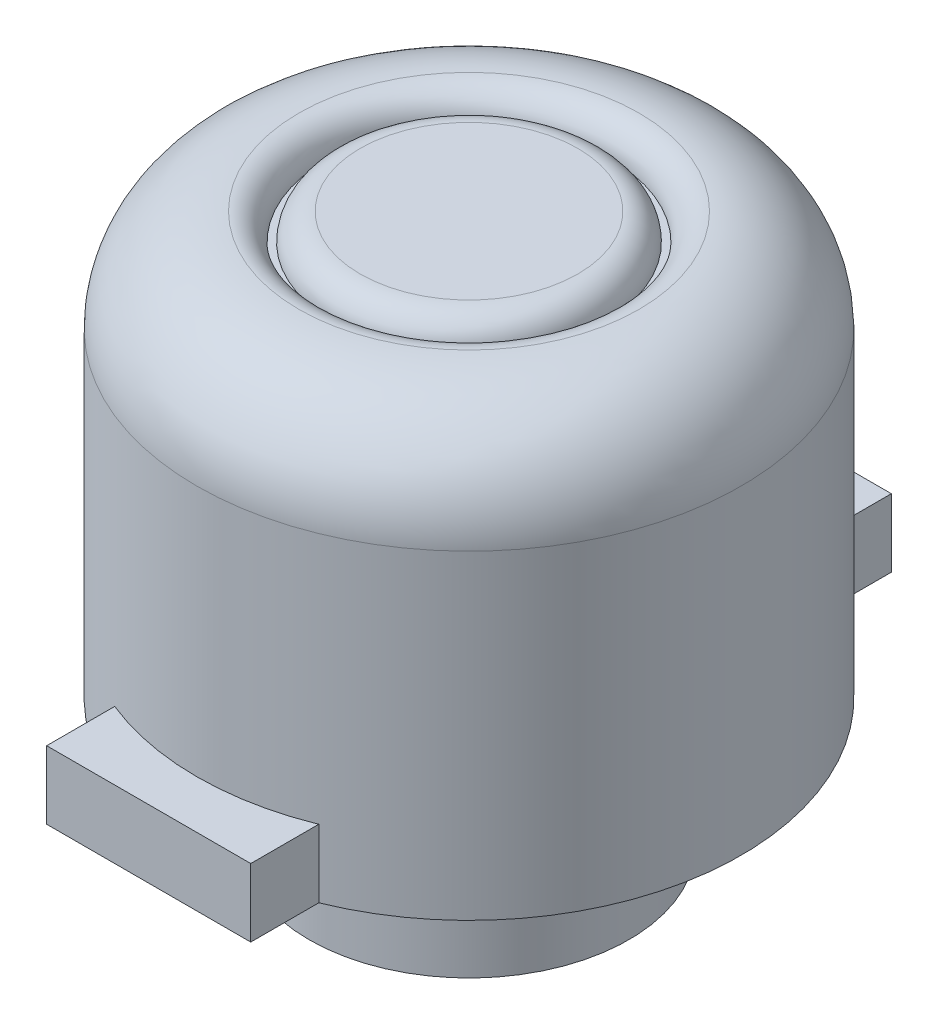
ISO-10303-21;
HEADER;
FILE_DESCRIPTION(('STEP AP214'),'2;1');
FILE_NAME('part.step','',(''),(''),'','','');
FILE_SCHEMA(('AUTOMOTIVE_DESIGN { 1 0 10303 214 1 1 1 1 }'));
ENDSEC;
DATA;
#1=APPLICATION_CONTEXT('core data for automotive mechanical design processes');
#2=APPLICATION_PROTOCOL_DEFINITION('international standard','automotive_design',2000,#1);
#3=PRODUCT_CONTEXT('',#1,'mechanical');
#4=PRODUCT('Part','Part','',(#3));
#5=PRODUCT_RELATED_PRODUCT_CATEGORY('part','',(#4));
#6=PRODUCT_DEFINITION_FORMATION('','',#4);
#7=PRODUCT_DEFINITION_CONTEXT('part definition',#1,'design');
#8=PRODUCT_DEFINITION('design','',#6,#7);
#9=PRODUCT_DEFINITION_SHAPE('','',#8);
#10=(LENGTH_UNIT() NAMED_UNIT(*) SI_UNIT(.MILLI.,.METRE.));
#11=(NAMED_UNIT(*) PLANE_ANGLE_UNIT() SI_UNIT($,.RADIAN.));
#12=(NAMED_UNIT(*) SI_UNIT($,.STERADIAN.) SOLID_ANGLE_UNIT());
#13=UNCERTAINTY_MEASURE_WITH_UNIT(LENGTH_MEASURE(1.E-05),#10,'distance_accuracy_value','');
#14=(GEOMETRIC_REPRESENTATION_CONTEXT(3) GLOBAL_UNCERTAINTY_ASSIGNED_CONTEXT((#13)) GLOBAL_UNIT_ASSIGNED_CONTEXT((#10,
#11,#12)) REPRESENTATION_CONTEXT('',''));
#15=CARTESIAN_POINT('',(0.,0.,0.));
#16=DIRECTION('',(0.,0.,1.));
#17=DIRECTION('',(1.,0.,0.));
#18=AXIS2_PLACEMENT_3D('',#15,#16,#17);
#19=CARTESIAN_POINT('',(0.,0.,0.));
#20=DIRECTION('',(0.,-1.,0.));
#21=DIRECTION('',(0.,0.,-1.));
#22=AXIS2_PLACEMENT_3D('',#19,#20,#21);
#23=CYLINDRICAL_SURFACE('',#22,4.);
#24=CARTESIAN_POINT('',(0.,4.7,0.));
#25=DIRECTION('',(0.,1.,0.));
#26=DIRECTION('',(0.,0.,1.));
#27=AXIS2_PLACEMENT_3D('',#24,#25,#26);
#28=CIRCLE('',#27,4.);
#29=CARTESIAN_POINT('',(0.,4.7,4.));
#30=VERTEX_POINT('',#29);
#31=EDGE_CURVE('E139',#30,#30,#28,.F.);
#32=ORIENTED_EDGE('',*,*,#31,.T.);
#33=EDGE_LOOP('',(#32));
#34=FACE_BOUND('',#33,.T.);
#35=DIRECTION('',(0.,-1.,0.));
#36=VECTOR('',#35,1.);
#37=CARTESIAN_POINT('',(-1.5,1.,-3.70809924354783));
#38=LINE('',#37,#36);
#39=CARTESIAN_POINT('',(-1.5,1.,-3.70809924354783));
#40=VERTEX_POINT('',#39);
#41=CARTESIAN_POINT('',(-1.5,0.,-3.70809924354783));
#42=VERTEX_POINT('',#41);
#43=EDGE_CURVE('E115',#40,#42,#38,.T.);
#44=ORIENTED_EDGE('',*,*,#43,.T.);
#45=CARTESIAN_POINT('',(0.,0.,0.));
#46=DIRECTION('',(0.,-1.,0.));
#47=DIRECTION('',(0.,0.,-1.));
#48=AXIS2_PLACEMENT_3D('',#45,#46,#47);
#49=CIRCLE('',#48,4.);
#50=CARTESIAN_POINT('',(-1.5,0.,3.70809924354783));
#51=VERTEX_POINT('',#50);
#52=EDGE_CURVE('E144',#51,#42,#49,.T.);
#53=ORIENTED_EDGE('',*,*,#52,.F.);
#54=DIRECTION('',(0.,-1.,0.));
#55=VECTOR('',#54,1.);
#56=CARTESIAN_POINT('',(-1.5,1.,3.70809924354783));
#57=LINE('',#56,#55);
#58=CARTESIAN_POINT('',(-1.5,1.,3.70809924354783));
#59=VERTEX_POINT('',#58);
#60=EDGE_CURVE('E220',#59,#51,#57,.T.);
#61=ORIENTED_EDGE('',*,*,#60,.F.);
#62=CARTESIAN_POINT('',(0.,1.,0.));
#63=DIRECTION('',(0.,1.,0.));
#64=DIRECTION('',(0.,0.,1.));
#65=AXIS2_PLACEMENT_3D('',#62,#63,#64);
#66=CIRCLE('',#65,4.);
#67=CARTESIAN_POINT('',(1.5,1.,3.70809924354783));
#68=VERTEX_POINT('',#67);
#69=EDGE_CURVE('E140',#68,#59,#66,.F.);
#70=ORIENTED_EDGE('',*,*,#69,.F.);
#71=DIRECTION('',(0.,-1.,0.));
#72=VECTOR('',#71,1.);
#73=CARTESIAN_POINT('',(1.5,1.,3.70809924354783));
#74=LINE('',#73,#72);
#75=CARTESIAN_POINT('',(1.5,0.,3.70809924354783));
#76=VERTEX_POINT('',#75);
#77=EDGE_CURVE('E227',#68,#76,#74,.T.);
#78=ORIENTED_EDGE('',*,*,#77,.T.);
#79=CARTESIAN_POINT('',(1.5,0.,-3.70809924354783));
#80=VERTEX_POINT('',#79);
#81=EDGE_CURVE('E241',#80,#76,#49,.T.);
#82=ORIENTED_EDGE('',*,*,#81,.F.);
#83=DIRECTION('',(0.,-1.,0.));
#84=VECTOR('',#83,1.);
#85=CARTESIAN_POINT('',(1.5,1.,-3.70809924354783));
#86=LINE('',#85,#84);
#87=CARTESIAN_POINT('',(1.5,1.,-3.70809924354783));
#88=VERTEX_POINT('',#87);
#89=EDGE_CURVE('E125',#88,#80,#86,.T.);
#90=ORIENTED_EDGE('',*,*,#89,.F.);
#91=CARTESIAN_POINT('',(0.,1.,0.));
#92=DIRECTION('',(0.,1.,0.));
#93=DIRECTION('',(0.,0.,1.));
#94=AXIS2_PLACEMENT_3D('',#91,#92,#93);
#95=CIRCLE('',#94,4.);
#96=EDGE_CURVE('E130',#40,#88,#95,.F.);
#97=ORIENTED_EDGE('',*,*,#96,.F.);
#98=EDGE_LOOP('',(#44,#53,#61,#70,#78,#82,#90,#97));
#99=FACE_BOUND('',#98,.T.);
#100=ADVANCED_FACE('F48',(#34,#99),#23,.T.);
#101=CARTESIAN_POINT('',(4.,0.,0.));
#102=DIRECTION('',(0.,-1.,0.));
#103=DIRECTION('',(0.,0.,-1.));
#104=AXIS2_PLACEMENT_3D('',#101,#102,#103);
#105=PLANE('',#104);
#106=ORIENTED_EDGE('',*,*,#52,.T.);
#107=DIRECTION('',(0.,0.,-1.));
#108=VECTOR('',#107,1.);
#109=CARTESIAN_POINT('',(-1.5,0.,-3.70809924354783));
#110=LINE('',#109,#108);
#111=CARTESIAN_POINT('',(-1.5,0.,-4.70809924354783));
#112=VERTEX_POINT('',#111);
#113=EDGE_CURVE('E121',#42,#112,#110,.T.);
#114=ORIENTED_EDGE('',*,*,#113,.T.);
#115=DIRECTION('',(1.,0.,0.));
#116=VECTOR('',#115,1.);
#117=CARTESIAN_POINT('',(-1.5,0.,-4.70809924354783));
#118=LINE('',#117,#116);
#119=CARTESIAN_POINT('',(1.5,0.,-4.70809924354783));
#120=VERTEX_POINT('',#119);
#121=EDGE_CURVE('E135',#112,#120,#118,.T.);
#122=ORIENTED_EDGE('',*,*,#121,.T.);
#123=DIRECTION('',(0.,0.,1.));
#124=VECTOR('',#123,1.);
#125=CARTESIAN_POINT('',(1.5,0.,-3.70809924354783));
#126=LINE('',#125,#124);
#127=EDGE_CURVE('E64',#120,#80,#126,.T.);
#128=ORIENTED_EDGE('',*,*,#127,.T.);
#129=ORIENTED_EDGE('',*,*,#81,.T.);
#130=DIRECTION('',(0.,0.,-1.));
#131=VECTOR('',#130,1.);
#132=CARTESIAN_POINT('',(1.5,0.,3.70809924354783));
#133=LINE('',#132,#131);
#134=CARTESIAN_POINT('',(1.5,0.,4.70809924354783));
#135=VERTEX_POINT('',#134);
#136=EDGE_CURVE('E216',#135,#76,#133,.T.);
#137=ORIENTED_EDGE('',*,*,#136,.F.);
#138=DIRECTION('',(1.,0.,0.));
#139=VECTOR('',#138,1.);
#140=CARTESIAN_POINT('',(-1.5,0.,4.70809924354783));
#141=LINE('',#140,#139);
#142=CARTESIAN_POINT('',(-1.5,0.,4.70809924354783));
#143=VERTEX_POINT('',#142);
#144=EDGE_CURVE('E222',#143,#135,#141,.T.);
#145=ORIENTED_EDGE('',*,*,#144,.F.);
#146=DIRECTION('',(0.,0.,1.));
#147=VECTOR('',#146,1.);
#148=CARTESIAN_POINT('',(-1.5,0.,3.70809924354783));
#149=LINE('',#148,#147);
#150=EDGE_CURVE('E71',#51,#143,#149,.T.);
#151=ORIENTED_EDGE('',*,*,#150,.F.);
#152=EDGE_LOOP('',(#106,#114,#122,#128,#129,#137,#145,#151));
#153=FACE_BOUND('',#152,.T.);
#154=CARTESIAN_POINT('',(0.,0.,0.));
#155=DIRECTION('',(0.,-1.,0.));
#156=DIRECTION('',(0.,0.,-1.));
#157=AXIS2_PLACEMENT_3D('',#154,#155,#156);
#158=CIRCLE('',#157,2.35);
#159=CARTESIAN_POINT('',(0.,0.,-2.35));
#160=VERTEX_POINT('',#159);
#161=EDGE_CURVE('E239',#160,#160,#158,.T.);
#162=ORIENTED_EDGE('',*,*,#161,.F.);
#163=EDGE_LOOP('',(#162));
#164=FACE_BOUND('',#163,.T.);
#165=ADVANCED_FACE('F161',(#153,#164),#105,.T.);
#166=CARTESIAN_POINT('',(-1.5,1.,3.70809924354783));
#167=DIRECTION('',(1.,0.,0.));
#168=DIRECTION('',(0.,0.,-1.));
#169=AXIS2_PLACEMENT_3D('',#166,#167,#168);
#170=PLANE('',#169);
#171=ORIENTED_EDGE('',*,*,#150,.T.);
#172=DIRECTION('',(0.,-1.,0.));
#173=VECTOR('',#172,1.);
#174=CARTESIAN_POINT('',(-1.5,1.,4.70809924354783));
#175=LINE('',#174,#173);
#176=CARTESIAN_POINT('',(-1.5,1.,4.70809924354783));
#177=VERTEX_POINT('',#176);
#178=EDGE_CURVE('E233',#177,#143,#175,.T.);
#179=ORIENTED_EDGE('',*,*,#178,.F.);
#180=DIRECTION('',(0.,0.,1.));
#181=VECTOR('',#180,1.);
#182=CARTESIAN_POINT('',(-1.5,1.,3.70809924354783));
#183=LINE('',#182,#181);
#184=EDGE_CURVE('E212',#59,#177,#183,.T.);
#185=ORIENTED_EDGE('',*,*,#184,.F.);
#186=ORIENTED_EDGE('',*,*,#60,.T.);
#187=EDGE_LOOP('',(#171,#179,#185,#186));
#188=FACE_BOUND('',#187,.T.);
#189=ADVANCED_FACE('F167',(#188),#170,.F.);
#190=CARTESIAN_POINT('',(-1.5,1.,4.70809924354783));
#191=DIRECTION('',(0.,0.,-1.));
#192=DIRECTION('',(-1.,0.,0.));
#193=AXIS2_PLACEMENT_3D('',#190,#191,#192);
#194=PLANE('',#193);
#195=ORIENTED_EDGE('',*,*,#144,.T.);
#196=DIRECTION('',(0.,-1.,0.));
#197=VECTOR('',#196,1.);
#198=CARTESIAN_POINT('',(1.5,1.,4.70809924354783));
#199=LINE('',#198,#197);
#200=CARTESIAN_POINT('',(1.5,1.,4.70809924354783));
#201=VERTEX_POINT('',#200);
#202=EDGE_CURVE('E230',#201,#135,#199,.T.);
#203=ORIENTED_EDGE('',*,*,#202,.F.);
#204=DIRECTION('',(1.,0.,0.));
#205=VECTOR('',#204,1.);
#206=CARTESIAN_POINT('',(-1.5,1.,4.70809924354783));
#207=LINE('',#206,#205);
#208=EDGE_CURVE('E215',#177,#201,#207,.T.);
#209=ORIENTED_EDGE('',*,*,#208,.F.);
#210=ORIENTED_EDGE('',*,*,#178,.T.);
#211=EDGE_LOOP('',(#195,#203,#209,#210));
#212=FACE_BOUND('',#211,.T.);
#213=ADVANCED_FACE('F257',(#212),#194,.F.);
#214=CARTESIAN_POINT('',(1.5,1.,3.70809924354783));
#215=DIRECTION('',(-1.,0.,0.));
#216=DIRECTION('',(0.,0.,1.));
#217=AXIS2_PLACEMENT_3D('',#214,#215,#216);
#218=PLANE('',#217);
#219=ORIENTED_EDGE('',*,*,#136,.T.);
#220=ORIENTED_EDGE('',*,*,#77,.F.);
#221=DIRECTION('',(0.,0.,-1.));
#222=VECTOR('',#221,1.);
#223=CARTESIAN_POINT('',(1.5,1.,3.70809924354783));
#224=LINE('',#223,#222);
#225=EDGE_CURVE('E218',#201,#68,#224,.T.);
#226=ORIENTED_EDGE('',*,*,#225,.F.);
#227=ORIENTED_EDGE('',*,*,#202,.T.);
#228=EDGE_LOOP('',(#219,#220,#226,#227));
#229=FACE_BOUND('',#228,.T.);
#230=ADVANCED_FACE('F246',(#229),#218,.F.);
#231=CARTESIAN_POINT('',(0.,1.,0.));
#232=DIRECTION('',(0.,1.,0.));
#233=DIRECTION('',(0.,0.,1.));
#234=AXIS2_PLACEMENT_3D('',#231,#232,#233);
#235=PLANE('',#234);
#236=ORIENTED_EDGE('',*,*,#225,.T.);
#237=ORIENTED_EDGE('',*,*,#69,.T.);
#238=ORIENTED_EDGE('',*,*,#184,.T.);
#239=ORIENTED_EDGE('',*,*,#208,.T.);
#240=EDGE_LOOP('',(#236,#237,#238,#239));
#241=FACE_BOUND('',#240,.T.);
#242=ADVANCED_FACE('F253',(#241),#235,.T.);
#243=CARTESIAN_POINT('',(-1.5,1.,-3.70809924354783));
#244=DIRECTION('',(-1.,0.,0.));
#245=DIRECTION('',(0.,0.,1.));
#246=AXIS2_PLACEMENT_3D('',#243,#244,#245);
#247=PLANE('',#246);
#248=ORIENTED_EDGE('',*,*,#113,.F.);
#249=ORIENTED_EDGE('',*,*,#43,.F.);
#250=DIRECTION('',(0.,0.,-1.));
#251=VECTOR('',#250,1.);
#252=CARTESIAN_POINT('',(-1.5,1.,-3.70809924354783));
#253=LINE('',#252,#251);
#254=CARTESIAN_POINT('',(-1.5,1.,-4.70809924354783));
#255=VERTEX_POINT('',#254);
#256=EDGE_CURVE('E118',#40,#255,#253,.T.);
#257=ORIENTED_EDGE('',*,*,#256,.T.);
#258=DIRECTION('',(0.,-1.,0.));
#259=VECTOR('',#258,1.);
#260=CARTESIAN_POINT('',(-1.5,1.,-4.70809924354783));
#261=LINE('',#260,#259);
#262=EDGE_CURVE('E204',#255,#112,#261,.T.);
#263=ORIENTED_EDGE('',*,*,#262,.T.);
#264=EDGE_LOOP('',(#248,#249,#257,#263));
#265=FACE_BOUND('',#264,.T.);
#266=ADVANCED_FACE('F117',(#265),#247,.T.);
#267=CARTESIAN_POINT('',(1.5,1.,-3.70809924354783));
#268=DIRECTION('',(1.,0.,0.));
#269=DIRECTION('',(0.,0.,-1.));
#270=AXIS2_PLACEMENT_3D('',#267,#268,#269);
#271=PLANE('',#270);
#272=ORIENTED_EDGE('',*,*,#127,.F.);
#273=DIRECTION('',(0.,-1.,0.));
#274=VECTOR('',#273,1.);
#275=CARTESIAN_POINT('',(1.5,1.,-4.70809924354783));
#276=LINE('',#275,#274);
#277=CARTESIAN_POINT('',(1.5,1.,-4.70809924354783));
#278=VERTEX_POINT('',#277);
#279=EDGE_CURVE('E209',#278,#120,#276,.T.);
#280=ORIENTED_EDGE('',*,*,#279,.F.);
#281=DIRECTION('',(0.,0.,1.));
#282=VECTOR('',#281,1.);
#283=CARTESIAN_POINT('',(1.5,1.,-3.70809924354783));
#284=LINE('',#283,#282);
#285=EDGE_CURVE('E134',#278,#88,#284,.T.);
#286=ORIENTED_EDGE('',*,*,#285,.T.);
#287=ORIENTED_EDGE('',*,*,#89,.T.);
#288=EDGE_LOOP('',(#272,#280,#286,#287));
#289=FACE_BOUND('',#288,.T.);
#290=ADVANCED_FACE('F295',(#289),#271,.T.);
#291=CARTESIAN_POINT('',(-1.5,1.,-4.70809924354783));
#292=DIRECTION('',(0.,0.,-1.));
#293=DIRECTION('',(-1.,0.,0.));
#294=AXIS2_PLACEMENT_3D('',#291,#292,#293);
#295=PLANE('',#294);
#296=ORIENTED_EDGE('',*,*,#121,.F.);
#297=ORIENTED_EDGE('',*,*,#262,.F.);
#298=DIRECTION('',(1.,0.,0.));
#299=VECTOR('',#298,1.);
#300=CARTESIAN_POINT('',(-1.5,1.,-4.70809924354783));
#301=LINE('',#300,#299);
#302=EDGE_CURVE('E133',#255,#278,#301,.T.);
#303=ORIENTED_EDGE('',*,*,#302,.T.);
#304=ORIENTED_EDGE('',*,*,#279,.T.);
#305=EDGE_LOOP('',(#296,#297,#303,#304));
#306=FACE_BOUND('',#305,.T.);
#307=ADVANCED_FACE('F292',(#306),#295,.T.);
#308=CARTESIAN_POINT('',(0.,1.,0.));
#309=DIRECTION('',(0.,1.,0.));
#310=DIRECTION('',(0.,0.,-1.));
#311=AXIS2_PLACEMENT_3D('',#308,#309,#310);
#312=PLANE('',#311);
#313=ORIENTED_EDGE('',*,*,#256,.F.);
#314=ORIENTED_EDGE('',*,*,#96,.T.);
#315=ORIENTED_EDGE('',*,*,#285,.F.);
#316=ORIENTED_EDGE('',*,*,#302,.F.);
#317=EDGE_LOOP('',(#313,#314,#315,#316));
#318=FACE_BOUND('',#317,.T.);
#319=ADVANCED_FACE('F128',(#318),#312,.T.);
#320=CARTESIAN_POINT('',(0.,4.7,0.));
#321=DIRECTION('',(0.,1.,0.));
#322=DIRECTION('',(0.,0.,1.));
#323=AXIS2_PLACEMENT_3D('',#320,#321,#322);
#324=TOROIDAL_SURFACE('',#323,2.5,1.5);
#325=CARTESIAN_POINT('',(0.,6.2,0.));
#326=DIRECTION('',(0.,1.,0.));
#327=DIRECTION('',(0.,0.,1.));
#328=AXIS2_PLACEMENT_3D('',#325,#326,#327);
#329=CIRCLE('',#328,2.5);
#330=CARTESIAN_POINT('',(0.,6.2,2.5));
#331=VERTEX_POINT('',#330);
#332=EDGE_CURVE('E57',#331,#331,#329,.T.);
#333=ORIENTED_EDGE('',*,*,#332,.F.);
#334=EDGE_LOOP('',(#333));
#335=FACE_BOUND('',#334,.T.);
#336=ORIENTED_EDGE('',*,*,#31,.F.);
#337=EDGE_LOOP('',(#336));
#338=FACE_BOUND('',#337,.T.);
#339=ADVANCED_FACE('F153',(#335,#338),#324,.T.);
#340=CARTESIAN_POINT('',(0.,5.8,0.));
#341=DIRECTION('',(0.,1.,0.));
#342=DIRECTION('',(0.,0.,1.));
#343=AXIS2_PLACEMENT_3D('',#340,#341,#342);
#344=PLANE('',#343);
#345=CARTESIAN_POINT('',(0.,5.8,0.));
#346=DIRECTION('',(0.,1.,0.));
#347=DIRECTION('',(0.,0.,1.));
#348=AXIS2_PLACEMENT_3D('',#345,#346,#347);
#349=CIRCLE('',#348,2.);
#350=CARTESIAN_POINT('',(0.,5.8,2.));
#351=VERTEX_POINT('',#350);
#352=EDGE_CURVE('E189',#351,#351,#349,.T.);
#353=ORIENTED_EDGE('',*,*,#352,.F.);
#354=EDGE_LOOP('',(#353));
#355=FACE_BOUND('',#354,.T.);
#356=CARTESIAN_POINT('',(0.,5.8,0.));
#357=DIRECTION('',(0.,1.,0.));
#358=DIRECTION('',(0.,0.,1.));
#359=AXIS2_PLACEMENT_3D('',#356,#357,#358);
#360=CIRCLE('',#359,2.1);
#361=CARTESIAN_POINT('',(0.,5.8,2.1));
#362=VERTEX_POINT('',#361);
#363=EDGE_CURVE('E192',#362,#362,#360,.T.);
#364=ORIENTED_EDGE('',*,*,#363,.T.);
#365=EDGE_LOOP('',(#364));
#366=FACE_BOUND('',#365,.T.);
#367=ADVANCED_FACE('F156',(#355,#366),#344,.T.);
#368=CARTESIAN_POINT('',(4.,6.2,0.));
#369=DIRECTION('',(0.,1.,0.));
#370=DIRECTION('',(0.,0.,1.));
#371=AXIS2_PLACEMENT_3D('',#368,#369,#370);
#372=PLANE('',#371);
#373=CARTESIAN_POINT('',(0.,6.2,0.));
#374=DIRECTION('',(0.,1.,0.));
#375=DIRECTION('',(0.,0.,1.));
#376=AXIS2_PLACEMENT_3D('',#373,#374,#375);
#377=CIRCLE('',#376,1.6);
#378=CARTESIAN_POINT('',(0.,6.2,1.6));
#379=VERTEX_POINT('',#378);
#380=EDGE_CURVE('E12',#379,#379,#377,.T.);
#381=ORIENTED_EDGE('',*,*,#380,.T.);
#382=EDGE_LOOP('',(#381));
#383=FACE_BOUND('',#382,.T.);
#384=ADVANCED_FACE('F171',(#383),#372,.T.);
#385=CARTESIAN_POINT('',(0.,5.8,0.));
#386=DIRECTION('',(0.,1.,0.));
#387=DIRECTION('',(0.,0.,1.));
#388=AXIS2_PLACEMENT_3D('',#385,#386,#387);
#389=TOROIDAL_SURFACE('',#388,2.5,0.4);
#390=ORIENTED_EDGE('',*,*,#332,.T.);
#391=EDGE_LOOP('',(#390));
#392=FACE_BOUND('',#391,.T.);
#393=ORIENTED_EDGE('',*,*,#363,.F.);
#394=EDGE_LOOP('',(#393));
#395=FACE_BOUND('',#394,.T.);
#396=ADVANCED_FACE('F150',(#392,#395),#389,.T.);
#397=CARTESIAN_POINT('',(0.,5.8,0.));
#398=DIRECTION('',(0.,1.,0.));
#399=DIRECTION('',(0.,0.,1.));
#400=AXIS2_PLACEMENT_3D('',#397,#398,#399);
#401=TOROIDAL_SURFACE('',#400,1.6,0.4);
#402=ORIENTED_EDGE('',*,*,#352,.T.);
#403=EDGE_LOOP('',(#402));
#404=FACE_BOUND('',#403,.T.);
#405=ORIENTED_EDGE('',*,*,#380,.F.);
#406=EDGE_LOOP('',(#405));
#407=FACE_BOUND('',#406,.T.);
#408=ADVANCED_FACE('F50',(#404,#407),#401,.T.);
#409=CARTESIAN_POINT('',(0.,4.4,0.));
#410=DIRECTION('',(0.,-1.,0.));
#411=DIRECTION('',(0.,0.,-1.));
#412=AXIS2_PLACEMENT_3D('',#409,#410,#411);
#413=CYLINDRICAL_SURFACE('',#412,2.35);
#414=ORIENTED_EDGE('',*,*,#161,.T.);
#415=EDGE_LOOP('',(#414));
#416=FACE_BOUND('',#415,.T.);
#417=CARTESIAN_POINT('',(0.,-1.9,0.));
#418=DIRECTION('',(0.,1.,0.));
#419=DIRECTION('',(0.,0.,1.));
#420=AXIS2_PLACEMENT_3D('',#417,#418,#419);
#421=CIRCLE('',#420,2.35);
#422=CARTESIAN_POINT('',(0.,-1.9,2.35));
#423=VERTEX_POINT('',#422);
#424=EDGE_CURVE('E198',#423,#423,#421,.T.);
#425=ORIENTED_EDGE('',*,*,#424,.T.);
#426=EDGE_LOOP('',(#425));
#427=FACE_BOUND('',#426,.T.);
#428=ADVANCED_FACE('F178',(#416,#427),#413,.T.);
#429=CARTESIAN_POINT('',(0.,-1.9,0.));
#430=DIRECTION('',(0.,1.,0.));
#431=DIRECTION('',(0.,0.,1.));
#432=AXIS2_PLACEMENT_3D('',#429,#430,#431);
#433=PLANE('',#432);
#434=ORIENTED_EDGE('',*,*,#424,.F.);
#435=EDGE_LOOP('',(#434));
#436=FACE_BOUND('',#435,.T.);
#437=ADVANCED_FACE('F183',(#436),#433,.F.);
#438=CLOSED_SHELL('',(#100,#165,#189,#213,#230,#242,#266,#290,#307,#319,#339,#367,#384,#396,
#408,#428,#437));
#439=CARTESIAN_POINT('',(2.35,5.4,0.));
#440=DIRECTION('',(0.,-1.,0.));
#441=DIRECTION('',(0.,0.,-1.));
#442=AXIS2_PLACEMENT_3D('',#439,#440,#441);
#443=PLANE('',#442);
#444=CARTESIAN_POINT('',(0.,5.4,0.));
#445=DIRECTION('',(0.,-1.,0.));
#446=DIRECTION('',(0.,0.,-1.));
#447=AXIS2_PLACEMENT_3D('',#444,#445,#446);
#448=CIRCLE('',#447,2.35);
#449=CARTESIAN_POINT('',(0.,5.4,-2.35));
#450=VERTEX_POINT('',#449);
#451=EDGE_CURVE('E236',#450,#450,#448,.T.);
#452=ORIENTED_EDGE('',*,*,#451,.T.);
#453=EDGE_LOOP('',(#452));
#454=FACE_BOUND('',#453,.T.);
#455=ADVANCED_FACE('F268',(#454),#443,.T.);
#456=CARTESIAN_POINT('',(0.,0.,0.));
#457=DIRECTION('',(0.,-1.,0.));
#458=DIRECTION('',(0.,0.,-1.));
#459=AXIS2_PLACEMENT_3D('',#456,#457,#458);
#460=CYLINDRICAL_SURFACE('',#459,2.35);
#461=ORIENTED_EDGE('',*,*,#451,.F.);
#462=EDGE_LOOP('',(#461));
#463=FACE_BOUND('',#462,.T.);
#464=CARTESIAN_POINT('',(0.,4.4,0.));
#465=DIRECTION('',(0.,-1.,0.));
#466=DIRECTION('',(0.,0.,-1.));
#467=AXIS2_PLACEMENT_3D('',#464,#465,#466);
#468=CIRCLE('',#467,2.35);
#469=CARTESIAN_POINT('',(0.,4.4,-2.35));
#470=VERTEX_POINT('',#469);
#471=EDGE_CURVE('E193',#470,#470,#468,.T.);
#472=ORIENTED_EDGE('',*,*,#471,.T.);
#473=EDGE_LOOP('',(#472));
#474=FACE_BOUND('',#473,.T.);
#475=ADVANCED_FACE('F270',(#463,#474),#460,.F.);
#476=CARTESIAN_POINT('',(0.,4.4,0.));
#477=DIRECTION('',(0.,-1.,0.));
#478=DIRECTION('',(0.,0.,-1.));
#479=AXIS2_PLACEMENT_3D('',#476,#477,#478);
#480=PLANE('',#479);
#481=ORIENTED_EDGE('',*,*,#471,.F.);
#482=EDGE_LOOP('',(#481));
#483=FACE_BOUND('',#482,.T.);
#484=ADVANCED_FACE('F274',(#483),#480,.F.);
#485=CLOSED_SHELL('',(#455,#475,#484));
#486=ORIENTED_CLOSED_SHELL('',*,#485,.T.);
#487=BREP_WITH_VOIDS('B2',#438,(#486));
#488=ADVANCED_BREP_SHAPE_REPRESENTATION('',(#18,#487),#14);
#489=SHAPE_DEFINITION_REPRESENTATION(#9,#488);
ENDSEC;
END-ISO-10303-21;
